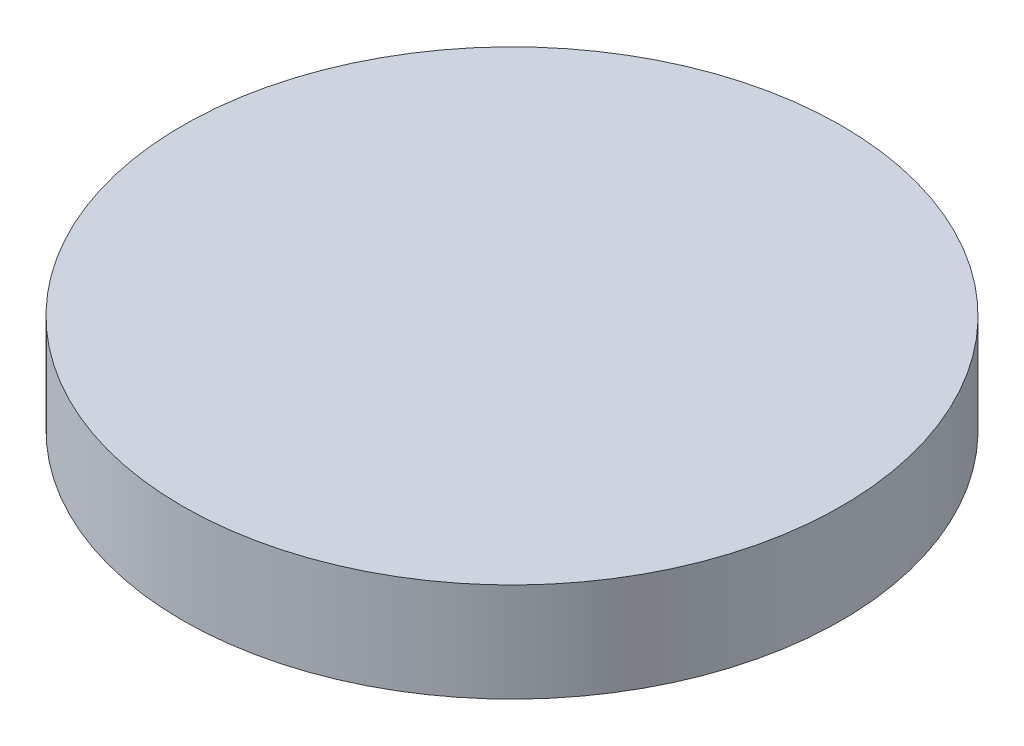
ISO-10303-21;
HEADER;
FILE_DESCRIPTION(('STEP AP214'),'2;1');
FILE_NAME('part.step','',(''),(''),'','','');
FILE_SCHEMA(('AUTOMOTIVE_DESIGN { 1 0 10303 214 1 1 1 1 }'));
ENDSEC;
DATA;
#1=APPLICATION_CONTEXT('core data for automotive mechanical design processes');
#2=APPLICATION_PROTOCOL_DEFINITION('international standard','automotive_design',2000,#1);
#3=PRODUCT_CONTEXT('',#1,'mechanical');
#4=PRODUCT('Part','Part','',(#3));
#5=PRODUCT_RELATED_PRODUCT_CATEGORY('part','',(#4));
#6=PRODUCT_DEFINITION_FORMATION('','',#4);
#7=PRODUCT_DEFINITION_CONTEXT('part definition',#1,'design');
#8=PRODUCT_DEFINITION('design','',#6,#7);
#9=PRODUCT_DEFINITION_SHAPE('','',#8);
#10=(LENGTH_UNIT() NAMED_UNIT(*) SI_UNIT(.MILLI.,.METRE.));
#11=(NAMED_UNIT(*) PLANE_ANGLE_UNIT() SI_UNIT($,.RADIAN.));
#12=(NAMED_UNIT(*) SI_UNIT($,.STERADIAN.) SOLID_ANGLE_UNIT());
#13=UNCERTAINTY_MEASURE_WITH_UNIT(LENGTH_MEASURE(1.E-05),#10,'distance_accuracy_value','');
#14=(GEOMETRIC_REPRESENTATION_CONTEXT(3) GLOBAL_UNCERTAINTY_ASSIGNED_CONTEXT((#13)) GLOBAL_UNIT_ASSIGNED_CONTEXT((#10,
#11,#12)) REPRESENTATION_CONTEXT('',''));
#15=CARTESIAN_POINT('',(0.,0.,0.));
#16=DIRECTION('',(0.,0.,1.));
#17=DIRECTION('',(1.,0.,0.));
#18=AXIS2_PLACEMENT_3D('',#15,#16,#17);
#19=CARTESIAN_POINT('',(0.,15.,0.));
#20=DIRECTION('',(0.,-1.,0.));
#21=DIRECTION('',(0.,0.,-1.));
#22=AXIS2_PLACEMENT_3D('',#19,#20,#21);
#23=CYLINDRICAL_SURFACE('',#22,50.);
#24=CARTESIAN_POINT('',(0.,15.,0.));
#25=DIRECTION('',(0.,1.,0.));
#26=DIRECTION('',(0.,0.,1.));
#27=AXIS2_PLACEMENT_3D('',#24,#25,#26);
#28=CIRCLE('',#27,50.);
#29=CARTESIAN_POINT('',(0.,15.,50.));
#30=VERTEX_POINT('',#29);
#31=EDGE_CURVE('E10',#30,#30,#28,.T.);
#32=ORIENTED_EDGE('',*,*,#31,.F.);
#33=EDGE_LOOP('',(#32));
#34=FACE_BOUND('',#33,.T.);
#35=CARTESIAN_POINT('',(0.,0.,0.));
#36=DIRECTION('',(0.,1.,0.));
#37=DIRECTION('',(0.,0.,1.));
#38=AXIS2_PLACEMENT_3D('',#35,#36,#37);
#39=CIRCLE('',#38,50.);
#40=CARTESIAN_POINT('',(0.,0.,50.));
#41=VERTEX_POINT('',#40);
#42=EDGE_CURVE('E34',#41,#41,#39,.T.);
#43=ORIENTED_EDGE('',*,*,#42,.T.);
#44=EDGE_LOOP('',(#43));
#45=FACE_BOUND('',#44,.T.);
#46=ADVANCED_FACE('F31',(#34,#45),#23,.T.);
#47=CARTESIAN_POINT('',(0.,15.,0.));
#48=DIRECTION('',(0.,1.,0.));
#49=DIRECTION('',(0.,0.,1.));
#50=AXIS2_PLACEMENT_3D('',#47,#48,#49);
#51=PLANE('',#50);
#52=ORIENTED_EDGE('',*,*,#31,.T.);
#53=EDGE_LOOP('',(#52));
#54=FACE_BOUND('',#53,.T.);
#55=ADVANCED_FACE('F46',(#54),#51,.T.);
#56=CARTESIAN_POINT('',(0.,0.,0.));
#57=DIRECTION('',(0.,1.,0.));
#58=DIRECTION('',(0.,0.,1.));
#59=AXIS2_PLACEMENT_3D('',#56,#57,#58);
#60=PLANE('',#59);
#61=ORIENTED_EDGE('',*,*,#42,.F.);
#62=EDGE_LOOP('',(#61));
#63=FACE_BOUND('',#62,.T.);
#64=ADVANCED_FACE('F44',(#63),#60,.F.);
#65=CLOSED_SHELL('',(#46,#55,#64));
#66=MANIFOLD_SOLID_BREP('B2',#65);
#67=ADVANCED_BREP_SHAPE_REPRESENTATION('',(#18,#66),#14);
#68=SHAPE_DEFINITION_REPRESENTATION(#9,#67);
ENDSEC;
END-ISO-10303-21;
